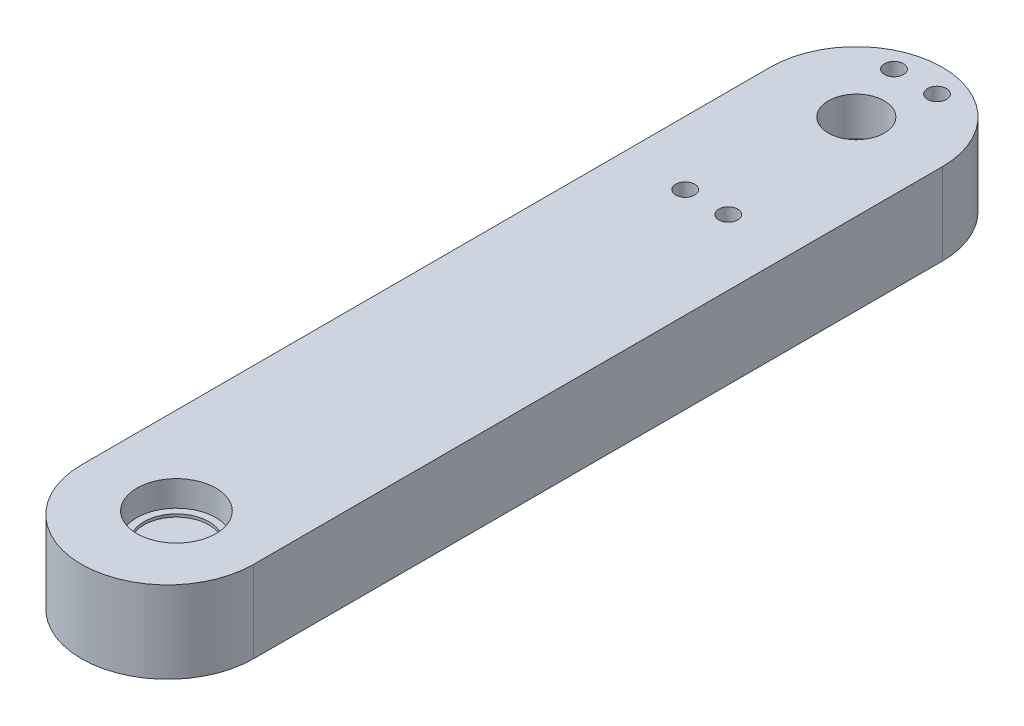
ISO-10303-21;
HEADER;
FILE_DESCRIPTION(('STEP AP214'),'2;1');
FILE_NAME('part.step','',(''),(''),'','','');
FILE_SCHEMA(('AUTOMOTIVE_DESIGN { 1 0 10303 214 1 1 1 1 }'));
ENDSEC;
DATA;
#1=APPLICATION_CONTEXT('core data for automotive mechanical design processes');
#2=APPLICATION_PROTOCOL_DEFINITION('international standard','automotive_design',2000,#1);
#3=PRODUCT_CONTEXT('',#1,'mechanical');
#4=PRODUCT('Part','Part','',(#3));
#5=PRODUCT_RELATED_PRODUCT_CATEGORY('part','',(#4));
#6=PRODUCT_DEFINITION_FORMATION('','',#4);
#7=PRODUCT_DEFINITION_CONTEXT('part definition',#1,'design');
#8=PRODUCT_DEFINITION('design','',#6,#7);
#9=PRODUCT_DEFINITION_SHAPE('','',#8);
#10=(LENGTH_UNIT() NAMED_UNIT(*) SI_UNIT(.MILLI.,.METRE.));
#11=(NAMED_UNIT(*) PLANE_ANGLE_UNIT() SI_UNIT($,.RADIAN.));
#12=(NAMED_UNIT(*) SI_UNIT($,.STERADIAN.) SOLID_ANGLE_UNIT());
#13=UNCERTAINTY_MEASURE_WITH_UNIT(LENGTH_MEASURE(1.E-05),#10,'distance_accuracy_value','');
#14=(GEOMETRIC_REPRESENTATION_CONTEXT(3) GLOBAL_UNCERTAINTY_ASSIGNED_CONTEXT((#13)) GLOBAL_UNIT_ASSIGNED_CONTEXT((#10,
#11,#12)) REPRESENTATION_CONTEXT('',''));
#15=CARTESIAN_POINT('',(0.,0.,0.));
#16=DIRECTION('',(0.,0.,1.));
#17=DIRECTION('',(1.,0.,0.));
#18=AXIS2_PLACEMENT_3D('',#15,#16,#17);
#19=CARTESIAN_POINT('',(6.79514853276821,59.0946913371175,146.807807616736));
#20=DIRECTION('',(0.,-1.,0.));
#21=DIRECTION('',(1.,0.,0.));
#22=AXIS2_PLACEMENT_3D('',#19,#20,#21);
#23=CYLINDRICAL_SURFACE('',#22,1.59999999999999);
#24=CARTESIAN_POINT('',(6.79514853276822,44.0946913371175,146.807807616736));
#25=DIRECTION('',(0.,-1.,0.));
#26=DIRECTION('',(1.,0.,0.));
#27=AXIS2_PLACEMENT_3D('',#24,#25,#26);
#28=CIRCLE('',#27,1.59999999999999);
#29=CARTESIAN_POINT('',(8.39514853276822,44.0946913371175,146.807807616736));
#30=VERTEX_POINT('',#29);
#31=EDGE_CURVE('E802',#30,#30,#28,.T.);
#32=ORIENTED_EDGE('',*,*,#31,.T.);
#33=EDGE_LOOP('',(#32));
#34=FACE_BOUND('',#33,.T.);
#35=CARTESIAN_POINT('',(6.79514853276822,53.0946913371175,146.807807616736));
#36=DIRECTION('',(0.,1.,0.));
#37=DIRECTION('',(-1.,0.,0.));
#38=AXIS2_PLACEMENT_3D('',#35,#36,#37);
#39=CIRCLE('',#38,1.59999999999999);
#40=CARTESIAN_POINT('',(5.19514853276822,53.0946913371175,146.807807616736));
#41=VERTEX_POINT('',#40);
#42=EDGE_CURVE('E250',#41,#41,#39,.F.);
#43=ORIENTED_EDGE('',*,*,#42,.F.);
#44=EDGE_LOOP('',(#43));
#45=FACE_BOUND('',#44,.T.);
#46=ADVANCED_FACE('F241',(#34,#45),#23,.F.);
#47=CARTESIAN_POINT('',(6.79514853276822,54.0946913371175,146.807807616736));
#48=DIRECTION('',(0.,-1.,0.));
#49=DIRECTION('',(1.,0.,0.));
#50=AXIS2_PLACEMENT_3D('',#47,#48,#49);
#51=CYLINDRICAL_SURFACE('',#50,20.);
#52=CARTESIAN_POINT('',(6.79514853276822,44.0946913371175,146.807807616736));
#53=DIRECTION('',(0.,1.,0.));
#54=DIRECTION('',(-1.,0.,0.));
#55=AXIS2_PLACEMENT_3D('',#52,#53,#54);
#56=CIRCLE('',#55,20.);
#57=CARTESIAN_POINT('',(-13.2048514672318,44.0946913371174,146.807807616736));
#58=VERTEX_POINT('',#57);
#59=CARTESIAN_POINT('',(26.7951485327682,44.0946913371175,146.807807616736));
#60=VERTEX_POINT('',#59);
#61=EDGE_CURVE('E375',#58,#60,#56,.T.);
#62=ORIENTED_EDGE('',*,*,#61,.T.);
#63=DIRECTION('',(0.,-1.,0.));
#64=VECTOR('',#63,1.);
#65=CARTESIAN_POINT('',(26.7951485327682,54.0946913371175,146.807807616736));
#66=LINE('',#65,#64);
#67=CARTESIAN_POINT('',(26.7951485327682,63.0946913371175,146.807807616736));
#68=VERTEX_POINT('',#67);
#69=EDGE_CURVE('E382',#68,#60,#66,.T.);
#70=ORIENTED_EDGE('',*,*,#69,.F.);
#71=CARTESIAN_POINT('',(6.7951485327682,63.0946913371175,146.807807616736));
#72=DIRECTION('',(0.,1.,0.));
#73=DIRECTION('',(-1.,0.,0.));
#74=AXIS2_PLACEMENT_3D('',#71,#72,#73);
#75=CIRCLE('',#74,20.);
#76=CARTESIAN_POINT('',(-13.2048514672318,63.0946913371174,146.807807616736));
#77=VERTEX_POINT('',#76);
#78=EDGE_CURVE('E516',#77,#68,#75,.T.);
#79=ORIENTED_EDGE('',*,*,#78,.F.);
#80=DIRECTION('',(0.,-1.,0.));
#81=VECTOR('',#80,1.);
#82=CARTESIAN_POINT('',(-13.2048514672318,54.0946913371174,146.807807616736));
#83=LINE('',#82,#81);
#84=EDGE_CURVE('E384',#77,#58,#83,.T.);
#85=ORIENTED_EDGE('',*,*,#84,.T.);
#86=EDGE_LOOP('',(#62,#70,#79,#85));
#87=FACE_BOUND('',#86,.T.);
#88=ADVANCED_FACE('F497',(#87),#51,.T.);
#89=CARTESIAN_POINT('',(-3.45485146723179,54.0946913371174,-23.1921923832638));
#90=DIRECTION('',(0.,0.,-1.));
#91=DIRECTION('',(-1.,0.,0.));
#92=AXIS2_PLACEMENT_3D('',#89,#90,#91);
#93=PLANE('',#92);
#94=DIRECTION('',(1.,0.,0.));
#95=VECTOR('',#94,1.);
#96=CARTESIAN_POINT('',(-3.45485146723179,54.0946913371174,-23.1921923832638));
#97=LINE('',#96,#95);
#98=CARTESIAN_POINT('',(15.5451485327682,54.0946913371175,-23.1921923832638));
#99=VERTEX_POINT('',#98);
#100=CARTESIAN_POINT('',(16.5451485327682,54.0946913371175,-23.1921923832638));
#101=VERTEX_POINT('',#100);
#102=EDGE_CURVE('E438',#99,#101,#97,.T.);
#103=ORIENTED_EDGE('',*,*,#102,.F.);
#104=DIRECTION('',(0.,-1.,0.));
#105=VECTOR('',#104,1.);
#106=CARTESIAN_POINT('',(15.5451485327682,54.0946913371175,-23.1921923832638));
#107=LINE('',#106,#105);
#108=CARTESIAN_POINT('',(15.5451485327682,44.0946913371175,-23.1921923832638));
#109=VERTEX_POINT('',#108);
#110=EDGE_CURVE('E427',#99,#109,#107,.T.);
#111=ORIENTED_EDGE('',*,*,#110,.T.);
#112=DIRECTION('',(1.,0.,0.));
#113=VECTOR('',#112,1.);
#114=CARTESIAN_POINT('',(-3.45485146723178,44.0946913371174,-23.1921923832638));
#115=LINE('',#114,#113);
#116=CARTESIAN_POINT('',(16.5451485327682,44.0946913371175,-23.1921923832638));
#117=VERTEX_POINT('',#116);
#118=EDGE_CURVE('E451',#109,#117,#115,.T.);
#119=ORIENTED_EDGE('',*,*,#118,.T.);
#120=DIRECTION('',(0.,-1.,0.));
#121=VECTOR('',#120,1.);
#122=CARTESIAN_POINT('',(16.5451485327682,54.0946913371175,-23.1921923832638));
#123=LINE('',#122,#121);
#124=EDGE_CURVE('E461',#101,#117,#123,.T.);
#125=ORIENTED_EDGE('',*,*,#124,.F.);
#126=EDGE_LOOP('',(#103,#111,#119,#125));
#127=FACE_BOUND('',#126,.T.);
#128=ADVANCED_FACE('F565',(#127),#93,.F.);
#129=CARTESIAN_POINT('',(16.5451485327682,54.0946913371175,-23.1921923832638));
#130=DIRECTION('',(1.,0.,0.));
#131=DIRECTION('',(0.,1.,0.));
#132=AXIS2_PLACEMENT_3D('',#129,#130,#131);
#133=PLANE('',#132);
#134=DIRECTION('',(0.,0.,1.));
#135=VECTOR('',#134,1.);
#136=CARTESIAN_POINT('',(16.5451485327682,44.0946913371175,-23.1921923832638));
#137=LINE('',#136,#135);
#138=CARTESIAN_POINT('',(16.5451485327682,44.0946913371175,17.3078076167362));
#139=VERTEX_POINT('',#138);
#140=EDGE_CURVE('E448',#117,#139,#137,.T.);
#141=ORIENTED_EDGE('',*,*,#140,.T.);
#142=DIRECTION('',(0.,-1.,0.));
#143=VECTOR('',#142,1.);
#144=CARTESIAN_POINT('',(16.5451485327682,54.0946913371175,17.3078076167362));
#145=LINE('',#144,#143);
#146=CARTESIAN_POINT('',(16.5451485327682,54.0946913371175,17.3078076167362));
#147=VERTEX_POINT('',#146);
#148=EDGE_CURVE('E464',#147,#139,#145,.T.);
#149=ORIENTED_EDGE('',*,*,#148,.F.);
#150=DIRECTION('',(0.,0.,1.));
#151=VECTOR('',#150,1.);
#152=CARTESIAN_POINT('',(16.5451485327682,54.0946913371175,-23.1921923832638));
#153=LINE('',#152,#151);
#154=EDGE_CURVE('E434',#101,#147,#153,.T.);
#155=ORIENTED_EDGE('',*,*,#154,.F.);
#156=ORIENTED_EDGE('',*,*,#124,.T.);
#157=EDGE_LOOP('',(#141,#149,#155,#156));
#158=FACE_BOUND('',#157,.T.);
#159=ADVANCED_FACE('F570',(#158),#133,.F.);
#160=CARTESIAN_POINT('',(-3.45485146723179,54.0946913371174,17.3078076167362));
#161=DIRECTION('',(0.,0.,-1.));
#162=DIRECTION('',(-1.,0.,0.));
#163=AXIS2_PLACEMENT_3D('',#160,#161,#162);
#164=PLANE('',#163);
#165=DIRECTION('',(1.,0.,0.));
#166=VECTOR('',#165,1.);
#167=CARTESIAN_POINT('',(-3.45485146723179,54.0946913371174,17.3078076167362));
#168=LINE('',#167,#166);
#169=CARTESIAN_POINT('',(15.5451485327682,54.0946913371175,17.3078076167362));
#170=VERTEX_POINT('',#169);
#171=EDGE_CURVE('E435',#170,#147,#168,.T.);
#172=ORIENTED_EDGE('',*,*,#171,.T.);
#173=ORIENTED_EDGE('',*,*,#148,.T.);
#174=DIRECTION('',(1.,0.,0.));
#175=VECTOR('',#174,1.);
#176=CARTESIAN_POINT('',(-3.45485146723178,44.0946913371174,17.3078076167362));
#177=LINE('',#176,#175);
#178=CARTESIAN_POINT('',(15.5451485327682,44.0946913371175,17.3078076167362));
#179=VERTEX_POINT('',#178);
#180=EDGE_CURVE('E430',#179,#139,#177,.T.);
#181=ORIENTED_EDGE('',*,*,#180,.F.);
#182=DIRECTION('',(0.,-1.,0.));
#183=VECTOR('',#182,1.);
#184=CARTESIAN_POINT('',(15.5451485327682,54.0946913371175,17.3078076167362));
#185=LINE('',#184,#183);
#186=EDGE_CURVE('E474',#170,#179,#185,.T.);
#187=ORIENTED_EDGE('',*,*,#186,.F.);
#188=EDGE_LOOP('',(#172,#173,#181,#187));
#189=FACE_BOUND('',#188,.T.);
#190=ADVANCED_FACE('F573',(#189),#164,.T.);
#191=CARTESIAN_POINT('',(15.5451485327682,54.0946913371175,24.1078076167362));
#192=DIRECTION('',(-1.,0.,0.));
#193=DIRECTION('',(0.,-1.,0.));
#194=AXIS2_PLACEMENT_3D('',#191,#192,#193);
#195=PLANE('',#194);
#196=DIRECTION('',(0.,0.,-1.));
#197=VECTOR('',#196,1.);
#198=CARTESIAN_POINT('',(15.5451485327682,44.0946913371175,24.1078076167362));
#199=LINE('',#198,#197);
#200=CARTESIAN_POINT('',(15.5451485327682,44.0946913371175,24.1078076167362));
#201=VERTEX_POINT('',#200);
#202=EDGE_CURVE('E466',#201,#179,#199,.T.);
#203=ORIENTED_EDGE('',*,*,#202,.F.);
#204=DIRECTION('',(0.,-1.,0.));
#205=VECTOR('',#204,1.);
#206=CARTESIAN_POINT('',(15.5451485327682,54.0946913371175,24.1078076167362));
#207=LINE('',#206,#205);
#208=CARTESIAN_POINT('',(15.5451485327682,54.0946913371175,24.1078076167362));
#209=VERTEX_POINT('',#208);
#210=EDGE_CURVE('E485',#209,#201,#207,.T.);
#211=ORIENTED_EDGE('',*,*,#210,.F.);
#212=DIRECTION('',(0.,0.,-1.));
#213=VECTOR('',#212,1.);
#214=CARTESIAN_POINT('',(15.5451485327682,54.0946913371175,24.1078076167362));
#215=LINE('',#214,#213);
#216=EDGE_CURVE('E467',#209,#170,#215,.T.);
#217=ORIENTED_EDGE('',*,*,#216,.T.);
#218=ORIENTED_EDGE('',*,*,#186,.T.);
#219=EDGE_LOOP('',(#203,#211,#217,#218));
#220=FACE_BOUND('',#219,.T.);
#221=ADVANCED_FACE('F582',(#220),#195,.T.);
#222=CARTESIAN_POINT('',(0.295148532768206,54.0946913371174,24.1078076167362));
#223=DIRECTION('',(0.,0.,-1.));
#224=DIRECTION('',(-1.,0.,0.));
#225=AXIS2_PLACEMENT_3D('',#222,#223,#224);
#226=PLANE('',#225);
#227=DIRECTION('',(1.,0.,0.));
#228=VECTOR('',#227,1.);
#229=CARTESIAN_POINT('',(0.295148532768213,44.0946913371174,24.1078076167362));
#230=LINE('',#229,#228);
#231=CARTESIAN_POINT('',(-2.45485146723179,44.0946913371174,24.1078076167362));
#232=VERTEX_POINT('',#231);
#233=EDGE_CURVE('E481',#232,#201,#230,.T.);
#234=ORIENTED_EDGE('',*,*,#233,.F.);
#235=DIRECTION('',(0.,-1.,0.));
#236=VECTOR('',#235,1.);
#237=CARTESIAN_POINT('',(-2.45485146723179,54.0946913371174,24.1078076167362));
#238=LINE('',#237,#236);
#239=CARTESIAN_POINT('',(-2.45485146723179,54.0946913371174,24.1078076167362));
#240=VERTEX_POINT('',#239);
#241=EDGE_CURVE('E482',#240,#232,#238,.T.);
#242=ORIENTED_EDGE('',*,*,#241,.F.);
#243=DIRECTION('',(1.,0.,0.));
#244=VECTOR('',#243,1.);
#245=CARTESIAN_POINT('',(0.295148532768206,54.0946913371174,24.1078076167362));
#246=LINE('',#245,#244);
#247=EDGE_CURVE('E490',#240,#209,#246,.T.);
#248=ORIENTED_EDGE('',*,*,#247,.T.);
#249=ORIENTED_EDGE('',*,*,#210,.T.);
#250=EDGE_LOOP('',(#234,#242,#248,#249));
#251=FACE_BOUND('',#250,.T.);
#252=ADVANCED_FACE('F579',(#251),#226,.T.);
#253=CARTESIAN_POINT('',(-2.45485146723179,54.0946913371174,24.1078076167362));
#254=DIRECTION('',(-1.,0.,0.));
#255=DIRECTION('',(0.,-1.,0.));
#256=AXIS2_PLACEMENT_3D('',#253,#254,#255);
#257=PLANE('',#256);
#258=DIRECTION('',(0.,0.,-1.));
#259=VECTOR('',#258,1.);
#260=CARTESIAN_POINT('',(-2.45485146723179,44.0946913371174,24.1078076167362));
#261=LINE('',#260,#259);
#262=CARTESIAN_POINT('',(-2.45485146723179,44.0946913371174,17.3078076167362));
#263=VERTEX_POINT('',#262);
#264=EDGE_CURVE('E471',#232,#263,#261,.T.);
#265=ORIENTED_EDGE('',*,*,#264,.T.);
#266=DIRECTION('',(0.,-1.,0.));
#267=VECTOR('',#266,1.);
#268=CARTESIAN_POINT('',(-2.45485146723179,54.0946913371174,17.3078076167362));
#269=LINE('',#268,#267);
#270=CARTESIAN_POINT('',(-2.45485146723179,54.0946913371174,17.3078076167362));
#271=VERTEX_POINT('',#270);
#272=EDGE_CURVE('E479',#271,#263,#269,.T.);
#273=ORIENTED_EDGE('',*,*,#272,.F.);
#274=DIRECTION('',(0.,0.,-1.));
#275=VECTOR('',#274,1.);
#276=CARTESIAN_POINT('',(-2.45485146723179,54.0946913371174,24.1078076167362));
#277=LINE('',#276,#275);
#278=EDGE_CURVE('E470',#240,#271,#277,.T.);
#279=ORIENTED_EDGE('',*,*,#278,.F.);
#280=ORIENTED_EDGE('',*,*,#241,.T.);
#281=EDGE_LOOP('',(#265,#273,#279,#280));
#282=FACE_BOUND('',#281,.T.);
#283=ADVANCED_FACE('F587',(#282),#257,.F.);
#284=ORIENTED_EDGE('',*,*,#272,.T.);
#285=CARTESIAN_POINT('',(-3.45485146723178,44.0946913371174,17.3078076167362));
#286=VERTEX_POINT('',#285);
#287=EDGE_CURVE('E445',#286,#263,#177,.T.);
#288=ORIENTED_EDGE('',*,*,#287,.F.);
#289=DIRECTION('',(0.,-1.,0.));
#290=VECTOR('',#289,1.);
#291=CARTESIAN_POINT('',(-3.45485146723179,54.0946913371174,17.3078076167362));
#292=LINE('',#291,#290);
#293=CARTESIAN_POINT('',(-3.45485146723179,54.0946913371174,17.3078076167362));
#294=VERTEX_POINT('',#293);
#295=EDGE_CURVE('E444',#294,#286,#292,.T.);
#296=ORIENTED_EDGE('',*,*,#295,.F.);
#297=EDGE_CURVE('E431',#294,#271,#168,.T.);
#298=ORIENTED_EDGE('',*,*,#297,.T.);
#299=EDGE_LOOP('',(#284,#288,#296,#298));
#300=FACE_BOUND('',#299,.T.);
#301=ADVANCED_FACE('F591',(#300),#164,.T.);
#302=CARTESIAN_POINT('',(-3.45485146723179,54.0946913371174,-23.1921923832638));
#303=DIRECTION('',(1.,0.,0.));
#304=DIRECTION('',(0.,1.,0.));
#305=AXIS2_PLACEMENT_3D('',#302,#303,#304);
#306=PLANE('',#305);
#307=DIRECTION('',(0.,0.,1.));
#308=VECTOR('',#307,1.);
#309=CARTESIAN_POINT('',(-3.45485146723178,44.0946913371174,-23.1921923832638));
#310=LINE('',#309,#308);
#311=CARTESIAN_POINT('',(-3.45485146723178,44.0946913371174,-23.1921923832638));
#312=VERTEX_POINT('',#311);
#313=EDGE_CURVE('E455',#312,#286,#310,.T.);
#314=ORIENTED_EDGE('',*,*,#313,.F.);
#315=DIRECTION('',(0.,-1.,0.));
#316=VECTOR('',#315,1.);
#317=CARTESIAN_POINT('',(-3.45485146723179,54.0946913371174,-23.1921923832638));
#318=LINE('',#317,#316);
#319=CARTESIAN_POINT('',(-3.45485146723179,54.0946913371174,-23.1921923832638));
#320=VERTEX_POINT('',#319);
#321=EDGE_CURVE('E459',#320,#312,#318,.T.);
#322=ORIENTED_EDGE('',*,*,#321,.F.);
#323=DIRECTION('',(0.,0.,1.));
#324=VECTOR('',#323,1.);
#325=CARTESIAN_POINT('',(-3.45485146723179,54.0946913371174,-23.1921923832638));
#326=LINE('',#325,#324);
#327=EDGE_CURVE('E441',#320,#294,#326,.T.);
#328=ORIENTED_EDGE('',*,*,#327,.T.);
#329=ORIENTED_EDGE('',*,*,#295,.T.);
#330=EDGE_LOOP('',(#314,#322,#328,#329));
#331=FACE_BOUND('',#330,.T.);
#332=ADVANCED_FACE('F595',(#331),#306,.T.);
#333=DIRECTION('',(0.,-1.,0.));
#334=VECTOR('',#333,1.);
#335=CARTESIAN_POINT('',(-2.45485146723179,54.0946913371174,-23.1921923832638));
#336=LINE('',#335,#334);
#337=CARTESIAN_POINT('',(-2.45485146723179,54.0946913371174,-23.1921923832638));
#338=VERTEX_POINT('',#337);
#339=CARTESIAN_POINT('',(-2.45485146723179,44.0946913371174,-23.1921923832638));
#340=VERTEX_POINT('',#339);
#341=EDGE_CURVE('E415',#338,#340,#336,.T.);
#342=ORIENTED_EDGE('',*,*,#341,.F.);
#343=EDGE_CURVE('E439',#320,#338,#97,.T.);
#344=ORIENTED_EDGE('',*,*,#343,.F.);
#345=ORIENTED_EDGE('',*,*,#321,.T.);
#346=EDGE_CURVE('E452',#312,#340,#115,.T.);
#347=ORIENTED_EDGE('',*,*,#346,.T.);
#348=EDGE_LOOP('',(#342,#344,#345,#347));
#349=FACE_BOUND('',#348,.T.);
#350=ADVANCED_FACE('F605',(#349),#93,.F.);
#351=CARTESIAN_POINT('',(-13.2048514672318,54.0946913371174,-13.1921923832638));
#352=DIRECTION('',(1.,0.,0.));
#353=DIRECTION('',(0.,1.,0.));
#354=AXIS2_PLACEMENT_3D('',#351,#352,#353);
#355=PLANE('',#354);
#356=DIRECTION('',(0.,0.,1.));
#357=VECTOR('',#356,1.);
#358=CARTESIAN_POINT('',(-13.2048514672318,44.0946913371174,-13.1921923832638));
#359=LINE('',#358,#357);
#360=CARTESIAN_POINT('',(-13.2048514672318,44.0946913371174,-13.1921923832638));
#361=VERTEX_POINT('',#360);
#362=EDGE_CURVE('E368',#361,#58,#359,.T.);
#363=ORIENTED_EDGE('',*,*,#362,.T.);
#364=ORIENTED_EDGE('',*,*,#84,.F.);
#365=DIRECTION('',(0.,0.,1.));
#366=VECTOR('',#365,1.);
#367=CARTESIAN_POINT('',(-13.2048514672318,63.0946913371174,-13.1921923832638));
#368=LINE('',#367,#366);
#369=CARTESIAN_POINT('',(-13.2048514672318,63.0946913371174,-13.1921923832638));
#370=VERTEX_POINT('',#369);
#371=EDGE_CURVE('E396',#370,#77,#368,.T.);
#372=ORIENTED_EDGE('',*,*,#371,.F.);
#373=DIRECTION('',(0.,-1.,0.));
#374=VECTOR('',#373,1.);
#375=CARTESIAN_POINT('',(-13.2048514672318,54.0946913371174,-13.1921923832638));
#376=LINE('',#375,#374);
#377=EDGE_CURVE('E373',#370,#361,#376,.T.);
#378=ORIENTED_EDGE('',*,*,#377,.T.);
#379=EDGE_LOOP('',(#363,#364,#372,#378));
#380=FACE_BOUND('',#379,.T.);
#381=ADVANCED_FACE('F532',(#380),#355,.F.);
#382=CARTESIAN_POINT('',(26.7951485327682,54.0946913371175,-13.1921923832638));
#383=DIRECTION('',(1.,0.,0.));
#384=DIRECTION('',(0.,1.,0.));
#385=AXIS2_PLACEMENT_3D('',#382,#383,#384);
#386=PLANE('',#385);
#387=DIRECTION('',(0.,0.,1.));
#388=VECTOR('',#387,1.);
#389=CARTESIAN_POINT('',(26.7951485327682,44.0946913371175,-13.1921923832638));
#390=LINE('',#389,#388);
#391=CARTESIAN_POINT('',(26.7951485327682,44.0946913371175,-13.1921923832638));
#392=VERTEX_POINT('',#391);
#393=EDGE_CURVE('E370',#392,#60,#390,.T.);
#394=ORIENTED_EDGE('',*,*,#393,.F.);
#395=DIRECTION('',(0.,-1.,0.));
#396=VECTOR('',#395,1.);
#397=CARTESIAN_POINT('',(26.7951485327682,54.0946913371175,-13.1921923832638));
#398=LINE('',#397,#396);
#399=CARTESIAN_POINT('',(26.7951485327682,63.0946913371175,-13.1921923832638));
#400=VERTEX_POINT('',#399);
#401=EDGE_CURVE('E380',#400,#392,#398,.T.);
#402=ORIENTED_EDGE('',*,*,#401,.F.);
#403=DIRECTION('',(0.,0.,-1.));
#404=VECTOR('',#403,1.);
#405=CARTESIAN_POINT('',(26.7951485327682,63.0946913371175,-13.1921923832638));
#406=LINE('',#405,#404);
#407=EDGE_CURVE('E509',#68,#400,#406,.T.);
#408=ORIENTED_EDGE('',*,*,#407,.F.);
#409=ORIENTED_EDGE('',*,*,#69,.T.);
#410=EDGE_LOOP('',(#394,#402,#408,#409));
#411=FACE_BOUND('',#410,.T.);
#412=ADVANCED_FACE('F506',(#411),#386,.T.);
#413=CARTESIAN_POINT('',(-2.45485146723179,54.0946913371174,-29.9921923832638));
#414=DIRECTION('',(1.,0.,0.));
#415=DIRECTION('',(0.,1.,0.));
#416=AXIS2_PLACEMENT_3D('',#413,#414,#415);
#417=PLANE('',#416);
#418=DIRECTION('',(0.,0.,1.));
#419=VECTOR('',#418,1.);
#420=CARTESIAN_POINT('',(-2.45485146723179,44.0946913371174,-29.9921923832638));
#421=LINE('',#420,#419);
#422=CARTESIAN_POINT('',(-2.45485146723179,44.0946913371174,-29.9921923832638));
#423=VERTEX_POINT('',#422);
#424=EDGE_CURVE('E410',#423,#340,#421,.T.);
#425=ORIENTED_EDGE('',*,*,#424,.F.);
#426=DIRECTION('',(0.,-1.,0.));
#427=VECTOR('',#426,1.);
#428=CARTESIAN_POINT('',(-2.45485146723179,54.0946913371174,-29.9921923832638));
#429=LINE('',#428,#427);
#430=CARTESIAN_POINT('',(-2.45485146723179,54.0946913371174,-29.9921923832638));
#431=VERTEX_POINT('',#430);
#432=EDGE_CURVE('E422',#431,#423,#429,.T.);
#433=ORIENTED_EDGE('',*,*,#432,.F.);
#434=DIRECTION('',(0.,0.,1.));
#435=VECTOR('',#434,1.);
#436=CARTESIAN_POINT('',(-2.45485146723179,54.0946913371174,-29.9921923832638));
#437=LINE('',#436,#435);
#438=EDGE_CURVE('E412',#431,#338,#437,.T.);
#439=ORIENTED_EDGE('',*,*,#438,.T.);
#440=ORIENTED_EDGE('',*,*,#341,.T.);
#441=EDGE_LOOP('',(#425,#433,#439,#440));
#442=FACE_BOUND('',#441,.T.);
#443=ADVANCED_FACE('F604',(#442),#417,.T.);
#444=CARTESIAN_POINT('',(6.79514853276822,54.0946913371175,146.807807616736));
#445=DIRECTION('',(0.,1.,0.));
#446=DIRECTION('',(-1.,0.,0.));
#447=AXIS2_PLACEMENT_3D('',#444,#445,#446);
#448=PLANE('',#447);
#449=CARTESIAN_POINT('',(6.7951485327682,54.0946913371175,-13.1921923832638));
#450=DIRECTION('',(0.,1.,0.));
#451=DIRECTION('',(-1.,0.,0.));
#452=AXIS2_PLACEMENT_3D('',#449,#450,#451);
#453=CIRCLE('',#452,20.);
#454=CARTESIAN_POINT('',(7.75514853276819,54.0946913371175,-33.1691390969136));
#455=VERTEX_POINT('',#454);
#456=CARTESIAN_POINT('',(4.72155950444481,54.0946913371175,-33.08440765813));
#457=VERTEX_POINT('',#456);
#458=EDGE_CURVE('E352',#455,#457,#453,.T.);
#459=ORIENTED_EDGE('',*,*,#458,.F.);
#460=DIRECTION('',(0.,0.,-1.));
#461=VECTOR('',#460,1.);
#462=CARTESIAN_POINT('',(7.75514853276819,54.0946913371175,-29.9921923832638));
#463=LINE('',#462,#461);
#464=CARTESIAN_POINT('',(7.75514853276819,54.0946913371175,-33.6921923832638));
#465=VERTEX_POINT('',#464);
#466=EDGE_CURVE('E389',#455,#465,#463,.T.);
#467=ORIENTED_EDGE('',*,*,#466,.T.);
#468=DIRECTION('',(1.,0.,0.));
#469=VECTOR('',#468,1.);
#470=CARTESIAN_POINT('',(4.72155950444481,54.0946913371174,-33.6921923832638));
#471=LINE('',#470,#469);
#472=CARTESIAN_POINT('',(4.72155950444481,54.0946913371174,-33.6921923832638));
#473=VERTEX_POINT('',#472);
#474=EDGE_CURVE('E363',#473,#465,#471,.T.);
#475=ORIENTED_EDGE('',*,*,#474,.F.);
#476=DIRECTION('',(0.,0.,-1.));
#477=VECTOR('',#476,1.);
#478=CARTESIAN_POINT('',(4.72155950444481,54.0946913371174,-29.9921923832638));
#479=LINE('',#478,#477);
#480=EDGE_CURVE('E391',#457,#473,#479,.T.);
#481=ORIENTED_EDGE('',*,*,#480,.F.);
#482=EDGE_LOOP('',(#459,#467,#475,#481));
#483=FACE_BOUND('',#482,.T.);
#484=ADVANCED_FACE('F612',(#483),#448,.T.);
#485=CARTESIAN_POINT('',(15.5451485327682,54.0946913371175,-29.9921923832638));
#486=DIRECTION('',(1.,0.,0.));
#487=DIRECTION('',(0.,1.,0.));
#488=AXIS2_PLACEMENT_3D('',#485,#486,#487);
#489=PLANE('',#488);
#490=DIRECTION('',(0.,0.,1.));
#491=VECTOR('',#490,1.);
#492=CARTESIAN_POINT('',(15.5451485327682,44.0946913371175,-29.9921923832638));
#493=LINE('',#492,#491);
#494=CARTESIAN_POINT('',(15.5451485327682,44.0946913371175,-29.9921923832638));
#495=VERTEX_POINT('',#494);
#496=EDGE_CURVE('E399',#495,#109,#493,.T.);
#497=ORIENTED_EDGE('',*,*,#496,.T.);
#498=ORIENTED_EDGE('',*,*,#110,.F.);
#499=DIRECTION('',(0.,0.,1.));
#500=VECTOR('',#499,1.);
#501=CARTESIAN_POINT('',(15.5451485327682,54.0946913371175,-29.9921923832638));
#502=LINE('',#501,#500);
#503=CARTESIAN_POINT('',(15.5451485327682,54.0946913371175,-29.9921923832638));
#504=VERTEX_POINT('',#503);
#505=EDGE_CURVE('E408',#504,#99,#502,.T.);
#506=ORIENTED_EDGE('',*,*,#505,.F.);
#507=DIRECTION('',(0.,-1.,0.));
#508=VECTOR('',#507,1.);
#509=CARTESIAN_POINT('',(15.5451485327682,54.0946913371175,-29.9921923832638));
#510=LINE('',#509,#508);
#511=EDGE_CURVE('E424',#504,#495,#510,.T.);
#512=ORIENTED_EDGE('',*,*,#511,.T.);
#513=EDGE_LOOP('',(#497,#498,#506,#512));
#514=FACE_BOUND('',#513,.T.);
#515=ADVANCED_FACE('F610',(#514),#489,.F.);
#516=CARTESIAN_POINT('',(6.79514853276822,44.0946913371175,146.807807616736));
#517=DIRECTION('',(0.,1.,0.));
#518=DIRECTION('',(-1.,0.,0.));
#519=AXIS2_PLACEMENT_3D('',#516,#517,#518);
#520=PLANE('',#519);
#521=ORIENTED_EDGE('',*,*,#31,.F.);
#522=EDGE_LOOP('',(#521));
#523=FACE_BOUND('',#522,.T.);
#524=ORIENTED_EDGE('',*,*,#496,.F.);
#525=DIRECTION('',(1.,0.,0.));
#526=VECTOR('',#525,1.);
#527=CARTESIAN_POINT('',(-2.45485146723179,44.0946913371174,-29.9921923832638));
#528=LINE('',#527,#526);
#529=EDGE_CURVE('E417',#423,#495,#528,.T.);
#530=ORIENTED_EDGE('',*,*,#529,.F.);
#531=ORIENTED_EDGE('',*,*,#424,.T.);
#532=ORIENTED_EDGE('',*,*,#346,.F.);
#533=ORIENTED_EDGE('',*,*,#313,.T.);
#534=ORIENTED_EDGE('',*,*,#287,.T.);
#535=ORIENTED_EDGE('',*,*,#264,.F.);
#536=ORIENTED_EDGE('',*,*,#233,.T.);
#537=ORIENTED_EDGE('',*,*,#202,.T.);
#538=ORIENTED_EDGE('',*,*,#180,.T.);
#539=ORIENTED_EDGE('',*,*,#140,.F.);
#540=ORIENTED_EDGE('',*,*,#118,.F.);
#541=EDGE_LOOP('',(#524,#530,#531,#532,#533,#534,#535,#536,#537,#538,#539,#540));
#542=FACE_BOUND('',#541,.T.);
#543=CARTESIAN_POINT('',(6.7951485327682,44.0946913371175,-13.1921923832638));
#544=DIRECTION('',(0.,1.,0.));
#545=DIRECTION('',(-1.,0.,0.));
#546=AXIS2_PLACEMENT_3D('',#543,#544,#545);
#547=CIRCLE('',#546,20.);
#548=CARTESIAN_POINT('',(4.72155950444481,44.0946913371175,-33.08440765813));
#549=VERTEX_POINT('',#548);
#550=EDGE_CURVE('E349',#549,#361,#547,.T.);
#551=ORIENTED_EDGE('',*,*,#550,.F.);
#552=DIRECTION('',(0.,0.,-1.));
#553=VECTOR('',#552,1.);
#554=CARTESIAN_POINT('',(4.72155950444481,44.0946913371174,-29.9921923832638));
#555=LINE('',#554,#553);
#556=CARTESIAN_POINT('',(4.72155950444481,44.0946913371174,-33.6921923832638));
#557=VERTEX_POINT('',#556);
#558=EDGE_CURVE('E356',#549,#557,#555,.T.);
#559=ORIENTED_EDGE('',*,*,#558,.T.);
#560=DIRECTION('',(1.,0.,0.));
#561=VECTOR('',#560,1.);
#562=CARTESIAN_POINT('',(4.72155950444481,44.0946913371174,-33.6921923832638));
#563=LINE('',#562,#561);
#564=CARTESIAN_POINT('',(7.7551485327682,44.0946913371175,-33.6921923832638));
#565=VERTEX_POINT('',#564);
#566=EDGE_CURVE('E394',#557,#565,#563,.T.);
#567=ORIENTED_EDGE('',*,*,#566,.T.);
#568=DIRECTION('',(0.,0.,-1.));
#569=VECTOR('',#568,1.);
#570=CARTESIAN_POINT('',(7.7551485327682,44.0946913371175,-29.9921923832638));
#571=LINE('',#570,#569);
#572=CARTESIAN_POINT('',(7.7551485327682,44.0946913371175,-33.1691390969136));
#573=VERTEX_POINT('',#572);
#574=EDGE_CURVE('E277',#573,#565,#571,.T.);
#575=ORIENTED_EDGE('',*,*,#574,.F.);
#576=EDGE_CURVE('E369',#392,#573,#547,.T.);
#577=ORIENTED_EDGE('',*,*,#576,.F.);
#578=ORIENTED_EDGE('',*,*,#393,.T.);
#579=ORIENTED_EDGE('',*,*,#61,.F.);
#580=ORIENTED_EDGE('',*,*,#362,.F.);
#581=EDGE_LOOP('',(#551,#559,#567,#575,#577,#578,#579,#580));
#582=FACE_BOUND('',#581,.T.);
#583=ADVANCED_FACE('F366',(#523,#542,#582),#520,.F.);
#584=CARTESIAN_POINT('',(-2.45485146723179,54.0946913371174,-29.9921923832638));
#585=DIRECTION('',(0.,0.,-1.));
#586=DIRECTION('',(-1.,0.,0.));
#587=AXIS2_PLACEMENT_3D('',#584,#585,#586);
#588=PLANE('',#587);
#589=ORIENTED_EDGE('',*,*,#529,.T.);
#590=ORIENTED_EDGE('',*,*,#511,.F.);
#591=DIRECTION('',(1.,0.,0.));
#592=VECTOR('',#591,1.);
#593=CARTESIAN_POINT('',(-2.45485146723179,54.0946913371174,-29.9921923832638));
#594=LINE('',#593,#592);
#595=EDGE_CURVE('E287',#431,#504,#594,.T.);
#596=ORIENTED_EDGE('',*,*,#595,.F.);
#597=ORIENTED_EDGE('',*,*,#432,.T.);
#598=EDGE_LOOP('',(#589,#590,#596,#597));
#599=FACE_BOUND('',#598,.T.);
#600=ADVANCED_FACE('F608',(#599),#588,.F.);
#601=CARTESIAN_POINT('',(6.7951485327682,54.0946913371175,-13.1921923832638));
#602=DIRECTION('',(0.,-1.,0.));
#603=DIRECTION('',(1.,0.,0.));
#604=AXIS2_PLACEMENT_3D('',#601,#602,#603);
#605=CYLINDRICAL_SURFACE('',#604,20.);
#606=ORIENTED_EDGE('',*,*,#377,.F.);
#607=CARTESIAN_POINT('',(6.79514853276819,63.0946913371175,-13.1921923832638));
#608=DIRECTION('',(0.,1.,0.));
#609=DIRECTION('',(-1.,0.,0.));
#610=AXIS2_PLACEMENT_3D('',#607,#608,#609);
#611=CIRCLE('',#610,20.);
#612=EDGE_CURVE('E515',#400,#370,#611,.T.);
#613=ORIENTED_EDGE('',*,*,#612,.F.);
#614=ORIENTED_EDGE('',*,*,#401,.T.);
#615=ORIENTED_EDGE('',*,*,#576,.T.);
#616=DIRECTION('',(0.,-1.,0.));
#617=VECTOR('',#616,1.);
#618=CARTESIAN_POINT('',(7.75514853276819,54.0946913371175,-33.1691390969136));
#619=LINE('',#618,#617);
#620=EDGE_CURVE('E353',#455,#573,#619,.T.);
#621=ORIENTED_EDGE('',*,*,#620,.F.);
#622=ORIENTED_EDGE('',*,*,#458,.T.);
#623=DIRECTION('',(0.,-1.,0.));
#624=VECTOR('',#623,1.);
#625=CARTESIAN_POINT('',(4.72155950444481,54.0946913371175,-33.08440765813));
#626=LINE('',#625,#624);
#627=EDGE_CURVE('E258',#457,#549,#626,.T.);
#628=ORIENTED_EDGE('',*,*,#627,.T.);
#629=ORIENTED_EDGE('',*,*,#550,.T.);
#630=EDGE_LOOP('',(#606,#613,#614,#615,#621,#622,#628,#629));
#631=FACE_BOUND('',#630,.T.);
#632=ADVANCED_FACE('F347',(#631),#605,.T.);
#633=CARTESIAN_POINT('',(4.72155950444481,54.0946913371174,-33.6921923832638));
#634=DIRECTION('',(0.,0.,-1.));
#635=DIRECTION('',(-1.,0.,0.));
#636=AXIS2_PLACEMENT_3D('',#633,#634,#635);
#637=PLANE('',#636);
#638=ORIENTED_EDGE('',*,*,#566,.F.);
#639=DIRECTION('',(0.,-1.,0.));
#640=VECTOR('',#639,1.);
#641=CARTESIAN_POINT('',(4.72155950444481,54.0946913371174,-33.6921923832638));
#642=LINE('',#641,#640);
#643=EDGE_CURVE('E359',#473,#557,#642,.T.);
#644=ORIENTED_EDGE('',*,*,#643,.F.);
#645=ORIENTED_EDGE('',*,*,#474,.T.);
#646=DIRECTION('',(0.,-1.,0.));
#647=VECTOR('',#646,1.);
#648=CARTESIAN_POINT('',(7.75514853276819,54.0946913371175,-33.6921923832638));
#649=LINE('',#648,#647);
#650=EDGE_CURVE('E393',#465,#565,#649,.T.);
#651=ORIENTED_EDGE('',*,*,#650,.T.);
#652=EDGE_LOOP('',(#638,#644,#645,#651));
#653=FACE_BOUND('',#652,.T.);
#654=ADVANCED_FACE('F243',(#653),#637,.T.);
#655=CARTESIAN_POINT('',(4.72155950444481,54.0946913371174,-29.9921923832638));
#656=DIRECTION('',(-1.,0.,0.));
#657=DIRECTION('',(0.,-1.,0.));
#658=AXIS2_PLACEMENT_3D('',#655,#656,#657);
#659=PLANE('',#658);
#660=ORIENTED_EDGE('',*,*,#627,.F.);
#661=ORIENTED_EDGE('',*,*,#480,.T.);
#662=ORIENTED_EDGE('',*,*,#643,.T.);
#663=ORIENTED_EDGE('',*,*,#558,.F.);
#664=EDGE_LOOP('',(#660,#661,#662,#663));
#665=FACE_BOUND('',#664,.T.);
#666=ADVANCED_FACE('F357',(#665),#659,.T.);
#667=CARTESIAN_POINT('',(7.75514853276819,54.0946913371175,-29.9921923832638));
#668=DIRECTION('',(-1.,0.,0.));
#669=DIRECTION('',(0.,-1.,0.));
#670=AXIS2_PLACEMENT_3D('',#667,#668,#669);
#671=PLANE('',#670);
#672=ORIENTED_EDGE('',*,*,#466,.F.);
#673=ORIENTED_EDGE('',*,*,#620,.T.);
#674=ORIENTED_EDGE('',*,*,#574,.T.);
#675=ORIENTED_EDGE('',*,*,#650,.F.);
#676=EDGE_LOOP('',(#672,#673,#674,#675));
#677=FACE_BOUND('',#676,.T.);
#678=ADVANCED_FACE('F664',(#677),#671,.F.);
#679=CARTESIAN_POINT('',(6.79514853276821,54.0946913371175,146.807807616736));
#680=DIRECTION('',(0.,1.,0.));
#681=DIRECTION('',(-1.,0.,0.));
#682=AXIS2_PLACEMENT_3D('',#679,#680,#681);
#683=PLANE('',#682);
#684=CARTESIAN_POINT('',(11.5451485327682,54.0946913371175,21.3078076167362));
#685=DIRECTION('',(0.,1.,0.));
#686=DIRECTION('',(-1.,0.,0.));
#687=AXIS2_PLACEMENT_3D('',#684,#685,#686);
#688=CIRCLE('',#687,2.20000000000002);
#689=CARTESIAN_POINT('',(9.34514853276818,54.0946913371175,21.3078076167362));
#690=VERTEX_POINT('',#689);
#691=EDGE_CURVE('E804',#690,#690,#688,.T.);
#692=ORIENTED_EDGE('',*,*,#691,.T.);
#693=EDGE_LOOP('',(#692));
#694=FACE_BOUND('',#693,.T.);
#695=CARTESIAN_POINT('',(1.54514853276821,54.0946913371174,21.3078076167362));
#696=DIRECTION('',(0.,1.,0.));
#697=DIRECTION('',(-1.,0.,0.));
#698=AXIS2_PLACEMENT_3D('',#695,#696,#697);
#699=CIRCLE('',#698,2.20000000000002);
#700=CARTESIAN_POINT('',(-0.654851467231815,54.0946913371174,21.3078076167362));
#701=VERTEX_POINT('',#700);
#702=EDGE_CURVE('E808',#701,#701,#699,.T.);
#703=ORIENTED_EDGE('',*,*,#702,.T.);
#704=EDGE_LOOP('',(#703));
#705=FACE_BOUND('',#704,.T.);
#706=CARTESIAN_POINT('',(11.5451485327682,54.0946913371175,-27.1921923832638));
#707=DIRECTION('',(0.,1.,0.));
#708=DIRECTION('',(-1.,0.,0.));
#709=AXIS2_PLACEMENT_3D('',#706,#707,#708);
#710=CIRCLE('',#709,2.20000000000002);
#711=CARTESIAN_POINT('',(9.34514853276819,54.0946913371175,-27.1921923832638));
#712=VERTEX_POINT('',#711);
#713=EDGE_CURVE('E814',#712,#712,#710,.T.);
#714=ORIENTED_EDGE('',*,*,#713,.T.);
#715=EDGE_LOOP('',(#714));
#716=FACE_BOUND('',#715,.T.);
#717=CARTESIAN_POINT('',(6.7951485327682,54.0946913371175,-13.1921923832638));
#718=DIRECTION('',(0.,1.,0.));
#719=DIRECTION('',(-1.,0.,0.));
#720=AXIS2_PLACEMENT_3D('',#717,#718,#719);
#721=CIRCLE('',#720,6.49999999999998);
#722=CARTESIAN_POINT('',(0.295148532768214,54.0946913371174,-13.1921923832638));
#723=VERTEX_POINT('',#722);
#724=EDGE_CURVE('E820',#723,#723,#721,.T.);
#725=ORIENTED_EDGE('',*,*,#724,.T.);
#726=EDGE_LOOP('',(#725));
#727=FACE_BOUND('',#726,.T.);
#728=CARTESIAN_POINT('',(1.54514853276821,54.0946913371174,-27.1921923832638));
#729=DIRECTION('',(0.,1.,0.));
#730=DIRECTION('',(-1.,0.,0.));
#731=AXIS2_PLACEMENT_3D('',#728,#729,#730);
#732=CIRCLE('',#731,2.20000000000003);
#733=CARTESIAN_POINT('',(-0.654851467231818,54.0946913371174,-27.1921923832638));
#734=VERTEX_POINT('',#733);
#735=EDGE_CURVE('E526',#734,#734,#732,.T.);
#736=ORIENTED_EDGE('',*,*,#735,.T.);
#737=EDGE_LOOP('',(#736));
#738=FACE_BOUND('',#737,.T.);
#739=ORIENTED_EDGE('',*,*,#438,.F.);
#740=ORIENTED_EDGE('',*,*,#595,.T.);
#741=ORIENTED_EDGE('',*,*,#505,.T.);
#742=ORIENTED_EDGE('',*,*,#102,.T.);
#743=ORIENTED_EDGE('',*,*,#154,.T.);
#744=ORIENTED_EDGE('',*,*,#171,.F.);
#745=ORIENTED_EDGE('',*,*,#216,.F.);
#746=ORIENTED_EDGE('',*,*,#247,.F.);
#747=ORIENTED_EDGE('',*,*,#278,.T.);
#748=ORIENTED_EDGE('',*,*,#297,.F.);
#749=ORIENTED_EDGE('',*,*,#327,.F.);
#750=ORIENTED_EDGE('',*,*,#343,.T.);
#751=EDGE_LOOP('',(#739,#740,#741,#742,#743,#744,#745,#746,#747,#748,#749,#750));
#752=FACE_BOUND('',#751,.T.);
#753=ADVANCED_FACE('F559',(#694,#705,#716,#727,#738,#752),#683,.F.);
#754=CARTESIAN_POINT('',(6.7951485327682,63.0946913371175,146.807807616736));
#755=DIRECTION('',(0.,1.,0.));
#756=DIRECTION('',(-1.,0.,0.));
#757=AXIS2_PLACEMENT_3D('',#754,#755,#756);
#758=PLANE('',#757);
#759=CARTESIAN_POINT('',(7.07409971566749,63.0946913371175,145.020183835729));
#760=DIRECTION('',(0.,1.,0.));
#761=DIRECTION('',(-1.,0.,0.));
#762=AXIS2_PLACEMENT_3D('',#759,#760,#761);
#763=CIRCLE('',#762,9.175);
#764=CARTESIAN_POINT('',(-2.10090028433251,63.0946913371175,145.020183835729));
#765=VERTEX_POINT('',#764);
#766=EDGE_CURVE('E797',#765,#765,#763,.T.);
#767=ORIENTED_EDGE('',*,*,#766,.F.);
#768=EDGE_LOOP('',(#767));
#769=FACE_BOUND('',#768,.T.);
#770=CARTESIAN_POINT('',(1.5451485327682,63.0946913371174,21.3078076167362));
#771=DIRECTION('',(0.,1.,0.));
#772=DIRECTION('',(-1.,0.,0.));
#773=AXIS2_PLACEMENT_3D('',#770,#771,#772);
#774=CIRCLE('',#773,2.20000000000002);
#775=CARTESIAN_POINT('',(-0.654851467231821,63.0946913371174,21.3078076167362));
#776=VERTEX_POINT('',#775);
#777=EDGE_CURVE('E811',#776,#776,#774,.T.);
#778=ORIENTED_EDGE('',*,*,#777,.F.);
#779=EDGE_LOOP('',(#778));
#780=FACE_BOUND('',#779,.T.);
#781=CARTESIAN_POINT('',(6.79514853276819,63.0946913371175,-13.1921923832638));
#782=DIRECTION('',(0.,1.,0.));
#783=DIRECTION('',(-1.,0.,0.));
#784=AXIS2_PLACEMENT_3D('',#781,#782,#783);
#785=CIRCLE('',#784,6.49999999999998);
#786=CARTESIAN_POINT('',(0.295148532768207,63.0946913371175,-13.1921923832638));
#787=VERTEX_POINT('',#786);
#788=EDGE_CURVE('E823',#787,#787,#785,.T.);
#789=ORIENTED_EDGE('',*,*,#788,.F.);
#790=EDGE_LOOP('',(#789));
#791=FACE_BOUND('',#790,.T.);
#792=ORIENTED_EDGE('',*,*,#78,.T.);
#793=ORIENTED_EDGE('',*,*,#407,.T.);
#794=ORIENTED_EDGE('',*,*,#612,.T.);
#795=ORIENTED_EDGE('',*,*,#371,.T.);
#796=EDGE_LOOP('',(#792,#793,#794,#795));
#797=FACE_BOUND('',#796,.T.);
#798=CARTESIAN_POINT('',(1.5451485327682,63.0946913371174,-27.1921923832638));
#799=DIRECTION('',(0.,1.,0.));
#800=DIRECTION('',(-1.,0.,0.));
#801=AXIS2_PLACEMENT_3D('',#798,#799,#800);
#802=CIRCLE('',#801,2.20000000000003);
#803=CARTESIAN_POINT('',(-0.654851467231825,63.0946913371174,-27.1921923832638));
#804=VERTEX_POINT('',#803);
#805=EDGE_CURVE('E523',#804,#804,#802,.T.);
#806=ORIENTED_EDGE('',*,*,#805,.F.);
#807=EDGE_LOOP('',(#806));
#808=FACE_BOUND('',#807,.T.);
#809=CARTESIAN_POINT('',(11.5451485327682,63.0946913371175,-27.1921923832638));
#810=DIRECTION('',(0.,1.,0.));
#811=DIRECTION('',(-1.,0.,0.));
#812=AXIS2_PLACEMENT_3D('',#809,#810,#811);
#813=CIRCLE('',#812,2.20000000000002);
#814=CARTESIAN_POINT('',(9.34514853276818,63.0946913371175,-27.1921923832638));
#815=VERTEX_POINT('',#814);
#816=EDGE_CURVE('E817',#815,#815,#813,.T.);
#817=ORIENTED_EDGE('',*,*,#816,.F.);
#818=EDGE_LOOP('',(#817));
#819=FACE_BOUND('',#818,.T.);
#820=CARTESIAN_POINT('',(11.5451485327682,63.0946913371175,21.3078076167362));
#821=DIRECTION('',(0.,1.,0.));
#822=DIRECTION('',(-1.,0.,0.));
#823=AXIS2_PLACEMENT_3D('',#820,#821,#822);
#824=CIRCLE('',#823,2.20000000000002);
#825=CARTESIAN_POINT('',(9.34514853276818,63.0946913371175,21.3078076167362));
#826=VERTEX_POINT('',#825);
#827=EDGE_CURVE('E805',#826,#826,#824,.T.);
#828=ORIENTED_EDGE('',*,*,#827,.F.);
#829=EDGE_LOOP('',(#828));
#830=FACE_BOUND('',#829,.T.);
#831=ADVANCED_FACE('F519',(#769,#780,#791,#797,#808,#819,#830),#758,.T.);
#832=CARTESIAN_POINT('',(1.5451485327682,63.0946913371174,-27.1921923832638));
#833=DIRECTION('',(0.,-1.,0.));
#834=DIRECTION('',(1.,0.,0.));
#835=AXIS2_PLACEMENT_3D('',#832,#833,#834);
#836=CYLINDRICAL_SURFACE('',#835,2.20000000000003);
#837=ORIENTED_EDGE('',*,*,#805,.T.);
#838=EDGE_LOOP('',(#837));
#839=FACE_BOUND('',#838,.T.);
#840=ORIENTED_EDGE('',*,*,#735,.F.);
#841=EDGE_LOOP('',(#840));
#842=FACE_BOUND('',#841,.T.);
#843=ADVANCED_FACE('F654',(#839,#842),#836,.F.);
#844=CARTESIAN_POINT('',(6.79514853276819,63.0946913371175,-13.1921923832638));
#845=DIRECTION('',(0.,-1.,0.));
#846=DIRECTION('',(1.,0.,0.));
#847=AXIS2_PLACEMENT_3D('',#844,#845,#846);
#848=CYLINDRICAL_SURFACE('',#847,6.49999999999998);
#849=ORIENTED_EDGE('',*,*,#788,.T.);
#850=EDGE_LOOP('',(#849));
#851=FACE_BOUND('',#850,.T.);
#852=ORIENTED_EDGE('',*,*,#724,.F.);
#853=EDGE_LOOP('',(#852));
#854=FACE_BOUND('',#853,.T.);
#855=ADVANCED_FACE('F650',(#851,#854),#848,.F.);
#856=CARTESIAN_POINT('',(11.5451485327682,63.0946913371175,-27.1921923832638));
#857=DIRECTION('',(0.,-1.,0.));
#858=DIRECTION('',(1.,0.,0.));
#859=AXIS2_PLACEMENT_3D('',#856,#857,#858);
#860=CYLINDRICAL_SURFACE('',#859,2.20000000000002);
#861=ORIENTED_EDGE('',*,*,#816,.T.);
#862=EDGE_LOOP('',(#861));
#863=FACE_BOUND('',#862,.T.);
#864=ORIENTED_EDGE('',*,*,#713,.F.);
#865=EDGE_LOOP('',(#864));
#866=FACE_BOUND('',#865,.T.);
#867=ADVANCED_FACE('F646',(#863,#866),#860,.F.);
#868=CARTESIAN_POINT('',(1.5451485327682,63.0946913371174,21.3078076167362));
#869=DIRECTION('',(0.,-1.,0.));
#870=DIRECTION('',(1.,0.,0.));
#871=AXIS2_PLACEMENT_3D('',#868,#869,#870);
#872=CYLINDRICAL_SURFACE('',#871,2.20000000000002);
#873=ORIENTED_EDGE('',*,*,#777,.T.);
#874=EDGE_LOOP('',(#873));
#875=FACE_BOUND('',#874,.T.);
#876=ORIENTED_EDGE('',*,*,#702,.F.);
#877=EDGE_LOOP('',(#876));
#878=FACE_BOUND('',#877,.T.);
#879=ADVANCED_FACE('F642',(#875,#878),#872,.F.);
#880=CARTESIAN_POINT('',(11.5451485327682,63.0946913371175,21.3078076167362));
#881=DIRECTION('',(0.,-1.,0.));
#882=DIRECTION('',(1.,0.,0.));
#883=AXIS2_PLACEMENT_3D('',#880,#881,#882);
#884=CYLINDRICAL_SURFACE('',#883,2.20000000000002);
#885=ORIENTED_EDGE('',*,*,#827,.T.);
#886=EDGE_LOOP('',(#885));
#887=FACE_BOUND('',#886,.T.);
#888=ORIENTED_EDGE('',*,*,#691,.F.);
#889=EDGE_LOOP('',(#888));
#890=FACE_BOUND('',#889,.T.);
#891=ADVANCED_FACE('F639',(#887,#890),#884,.F.);
#892=CARTESIAN_POINT('',(6.79514853276822,53.0946913371175,146.807807616736));
#893=DIRECTION('',(0.,1.,0.));
#894=DIRECTION('',(-1.,0.,0.));
#895=AXIS2_PLACEMENT_3D('',#892,#893,#894);
#896=PLANE('',#895);
#897=ORIENTED_EDGE('',*,*,#42,.T.);
#898=EDGE_LOOP('',(#897));
#899=FACE_BOUND('',#898,.T.);
#900=ADVANCED_FACE('F637',(#899),#896,.F.);
#901=CARTESIAN_POINT('',(7.0740997156675,56.4946913371175,145.020183835729));
#902=DIRECTION('',(0.,1.,0.));
#903=DIRECTION('',(-1.,0.,0.));
#904=AXIS2_PLACEMENT_3D('',#901,#902,#903);
#905=CYLINDRICAL_SURFACE('',#904,9.175);
#906=CARTESIAN_POINT('',(7.0740997156675,57.1446913371175,145.020183835729));
#907=DIRECTION('',(0.,1.,0.));
#908=DIRECTION('',(-1.,0.,0.));
#909=AXIS2_PLACEMENT_3D('',#906,#907,#908);
#910=CIRCLE('',#909,9.175);
#911=CARTESIAN_POINT('',(-2.10090028433251,57.1446913371174,145.020183835729));
#912=VERTEX_POINT('',#911);
#913=EDGE_CURVE('E794',#912,#912,#910,.T.);
#914=ORIENTED_EDGE('',*,*,#913,.F.);
#915=EDGE_LOOP('',(#914));
#916=FACE_BOUND('',#915,.T.);
#917=ORIENTED_EDGE('',*,*,#766,.T.);
#918=EDGE_LOOP('',(#917));
#919=FACE_BOUND('',#918,.T.);
#920=ADVANCED_FACE('F749',(#916,#919),#905,.F.);
#921=CARTESIAN_POINT('',(7.0740997156675,57.1446913371175,145.020183835729));
#922=DIRECTION('',(0.,1.,0.));
#923=DIRECTION('',(-1.,0.,0.));
#924=AXIS2_PLACEMENT_3D('',#921,#922,#923);
#925=PLANE('',#924);
#926=ORIENTED_EDGE('',*,*,#913,.T.);
#927=EDGE_LOOP('',(#926));
#928=FACE_BOUND('',#927,.T.);
#929=CARTESIAN_POINT('',(7.0740997156675,57.1446913371175,145.020183835729));
#930=DIRECTION('',(0.,1.,0.));
#931=DIRECTION('',(-1.,0.,0.));
#932=AXIS2_PLACEMENT_3D('',#929,#930,#931);
#933=CIRCLE('',#932,7.55);
#934=CARTESIAN_POINT('',(-0.475900284332502,57.1446913371174,145.020183835729));
#935=VERTEX_POINT('',#934);
#936=EDGE_CURVE('E791',#935,#935,#933,.T.);
#937=ORIENTED_EDGE('',*,*,#936,.F.);
#938=EDGE_LOOP('',(#937));
#939=FACE_BOUND('',#938,.T.);
#940=ADVANCED_FACE('F756',(#928,#939),#925,.T.);
#941=CARTESIAN_POINT('',(7.0740997156675,57.1446913371175,145.020183835729));
#942=DIRECTION('',(0.,-1.,0.));
#943=DIRECTION('',(1.,0.,0.));
#944=AXIS2_PLACEMENT_3D('',#941,#942,#943);
#945=CYLINDRICAL_SURFACE('',#944,7.55);
#946=ORIENTED_EDGE('',*,*,#936,.T.);
#947=EDGE_LOOP('',(#946));
#948=FACE_BOUND('',#947,.T.);
#949=CARTESIAN_POINT('',(7.0740997156675,56.4946913371175,145.020183835729));
#950=DIRECTION('',(0.,1.,0.));
#951=DIRECTION('',(-1.,0.,0.));
#952=AXIS2_PLACEMENT_3D('',#949,#950,#951);
#953=CIRCLE('',#952,7.55);
#954=CARTESIAN_POINT('',(-0.475900284332502,56.4946913371174,145.020183835729));
#955=VERTEX_POINT('',#954);
#956=EDGE_CURVE('E12',#955,#955,#953,.F.);
#957=ORIENTED_EDGE('',*,*,#956,.T.);
#958=EDGE_LOOP('',(#957));
#959=FACE_BOUND('',#958,.T.);
#960=ADVANCED_FACE('F767',(#948,#959),#945,.F.);
#961=CARTESIAN_POINT('',(7.0740997156675,56.4946913371175,145.020183835729));
#962=DIRECTION('',(0.,1.,0.));
#963=DIRECTION('',(-1.,0.,0.));
#964=AXIS2_PLACEMENT_3D('',#961,#962,#963);
#965=PLANE('',#964);
#966=ORIENTED_EDGE('',*,*,#956,.F.);
#967=EDGE_LOOP('',(#966));
#968=FACE_BOUND('',#967,.T.);
#969=ADVANCED_FACE('F762',(#968),#965,.T.);
#970=CLOSED_SHELL('',(#46,#88,#128,#159,#190,#221,#252,#283,#301,#332,#350,#381,#412,#443,#484,
#515,#583,#600,#632,#654,#666,#678,#753,#831,#843,#855,#867,#879,#891,#900,#920,#940,#960,#969));
#971=MANIFOLD_SOLID_BREP('B2',#970);
#972=ADVANCED_BREP_SHAPE_REPRESENTATION('',(#18,#971),#14);
#973=SHAPE_DEFINITION_REPRESENTATION(#9,#972);
ENDSEC;
END-ISO-10303-21;
